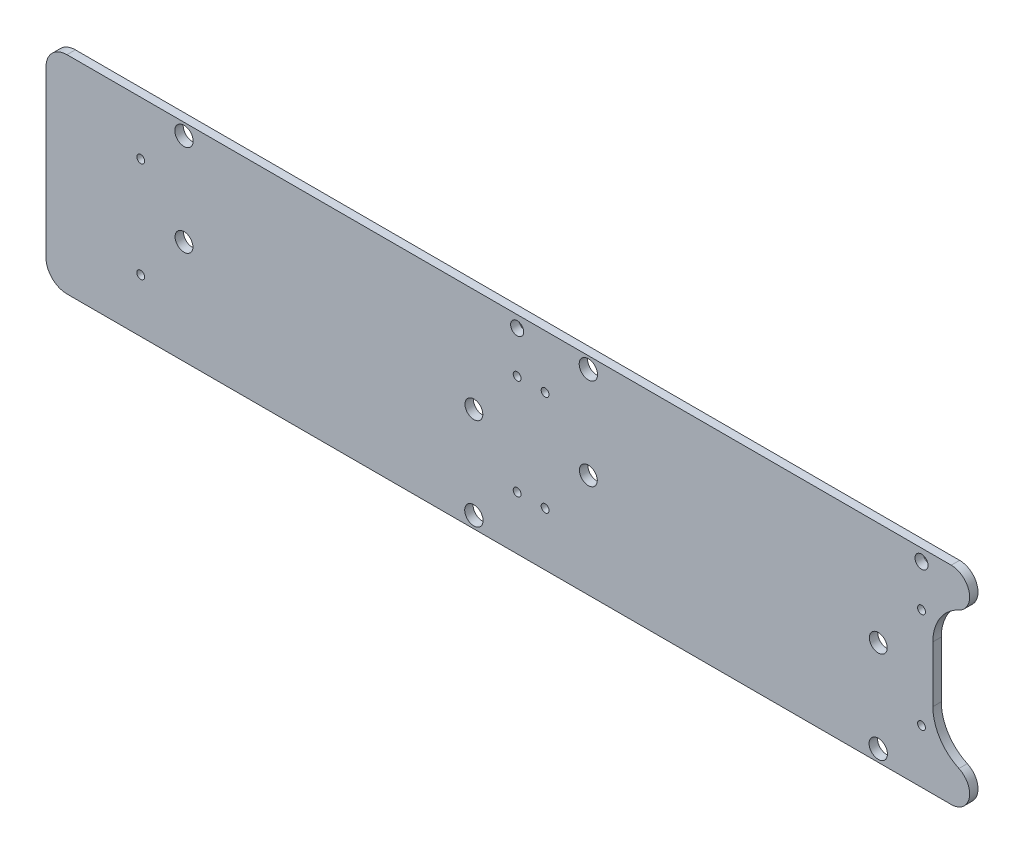
ISO-10303-21;
HEADER;
FILE_DESCRIPTION(('STEP AP214'),'2;1');
FILE_NAME('part.step','',(''),(''),'','','');
FILE_SCHEMA(('AUTOMOTIVE_DESIGN { 1 0 10303 214 1 1 1 1 }'));
ENDSEC;
DATA;
#1=APPLICATION_CONTEXT('core data for automotive mechanical design processes');
#2=APPLICATION_PROTOCOL_DEFINITION('international standard','automotive_design',2000,#1);
#3=PRODUCT_CONTEXT('',#1,'mechanical');
#4=PRODUCT('Part','Part','',(#3));
#5=PRODUCT_RELATED_PRODUCT_CATEGORY('part','',(#4));
#6=PRODUCT_DEFINITION_FORMATION('','',#4);
#7=PRODUCT_DEFINITION_CONTEXT('part definition',#1,'design');
#8=PRODUCT_DEFINITION('design','',#6,#7);
#9=PRODUCT_DEFINITION_SHAPE('','',#8);
#10=(LENGTH_UNIT() NAMED_UNIT(*) SI_UNIT(.MILLI.,.METRE.));
#11=(NAMED_UNIT(*) PLANE_ANGLE_UNIT() SI_UNIT($,.RADIAN.));
#12=(NAMED_UNIT(*) SI_UNIT($,.STERADIAN.) SOLID_ANGLE_UNIT());
#13=UNCERTAINTY_MEASURE_WITH_UNIT(LENGTH_MEASURE(1.E-05),#10,'distance_accuracy_value','');
#14=(GEOMETRIC_REPRESENTATION_CONTEXT(3) GLOBAL_UNCERTAINTY_ASSIGNED_CONTEXT((#13)) GLOBAL_UNIT_ASSIGNED_CONTEXT((#10,
#11,#12)) REPRESENTATION_CONTEXT('',''));
#15=CARTESIAN_POINT('',(0.,0.,0.));
#16=DIRECTION('',(0.,0.,1.));
#17=DIRECTION('',(1.,0.,0.));
#18=AXIS2_PLACEMENT_3D('',#15,#16,#17);
#19=CARTESIAN_POINT('',(0.,0.,0.));
#20=DIRECTION('',(0.,0.,-1.));
#21=DIRECTION('',(-1.,0.,0.));
#22=AXIS2_PLACEMENT_3D('',#19,#20,#21);
#23=PLANE('',#22);
#24=CARTESIAN_POINT('',(144.094561670845,20.25,0.));
#25=DIRECTION('',(0.,0.,-1.));
#26=DIRECTION('',(-1.,0.,0.));
#27=AXIS2_PLACEMENT_3D('',#24,#25,#26);
#28=CIRCLE('',#27,1.69999999999998);
#29=CARTESIAN_POINT('',(142.394561670845,20.25,0.));
#30=VERTEX_POINT('',#29);
#31=EDGE_CURVE('E333',#30,#30,#28,.T.);
#32=ORIENTED_EDGE('',*,*,#31,.F.);
#33=EDGE_LOOP('',(#32));
#34=FACE_BOUND('',#33,.T.);
#35=CARTESIAN_POINT('',(88.849561670845,20.25,0.));
#36=DIRECTION('',(0.,0.,-1.));
#37=DIRECTION('',(-1.,0.,0.));
#38=AXIS2_PLACEMENT_3D('',#35,#36,#37);
#39=CIRCLE('',#38,1.69999999999999);
#40=CARTESIAN_POINT('',(87.149561670845,20.25,0.));
#41=VERTEX_POINT('',#40);
#42=EDGE_CURVE('E335',#41,#41,#39,.T.);
#43=ORIENTED_EDGE('',*,*,#42,.F.);
#44=EDGE_LOOP('',(#43));
#45=FACE_BOUND('',#44,.T.);
#46=CARTESIAN_POINT('',(67.0386850125363,20.25,0.));
#47=DIRECTION('',(0.,0.,-1.));
#48=DIRECTION('',(-1.,0.,0.));
#49=AXIS2_PLACEMENT_3D('',#46,#47,#48);
#50=CIRCLE('',#49,1.69999999999999);
#51=CARTESIAN_POINT('',(65.3386850125364,20.25,0.));
#52=VERTEX_POINT('',#51);
#53=EDGE_CURVE('E343',#52,#52,#50,.T.);
#54=ORIENTED_EDGE('',*,*,#53,.F.);
#55=EDGE_LOOP('',(#54));
#56=FACE_BOUND('',#55,.T.);
#57=CARTESIAN_POINT('',(11.7936850125363,20.25,0.));
#58=DIRECTION('',(0.,0.,-1.));
#59=DIRECTION('',(-1.,0.,0.));
#60=AXIS2_PLACEMENT_3D('',#57,#58,#59);
#61=CIRCLE('',#60,1.69999999999999);
#62=CARTESIAN_POINT('',(10.0936850125363,20.25,0.));
#63=VERTEX_POINT('',#62);
#64=EDGE_CURVE('E349',#63,#63,#61,.T.);
#65=ORIENTED_EDGE('',*,*,#64,.F.);
#66=EDGE_LOOP('',(#65));
#67=FACE_BOUND('',#66,.T.);
#68=CARTESIAN_POINT('',(75.2809850125364,37.7506,0.));
#69=DIRECTION('',(0.,0.,-1.));
#70=DIRECTION('',(-1.,0.,0.));
#71=AXIS2_PLACEMENT_3D('',#68,#69,#70);
#72=CIRCLE('',#71,1.25);
#73=CARTESIAN_POINT('',(74.0309850125363,37.7506,0.));
#74=VERTEX_POINT('',#73);
#75=EDGE_CURVE('E358',#74,#74,#72,.T.);
#76=ORIENTED_EDGE('',*,*,#75,.F.);
#77=EDGE_LOOP('',(#76));
#78=FACE_BOUND('',#77,.T.);
#79=CARTESIAN_POINT('',(152.336861670845,37.7506,0.));
#80=DIRECTION('',(0.,0.,-1.));
#81=DIRECTION('',(-1.,0.,0.));
#82=AXIS2_PLACEMENT_3D('',#79,#80,#81);
#83=CIRCLE('',#82,1.25000000000001);
#84=CARTESIAN_POINT('',(151.086861670845,37.7506,0.));
#85=VERTEX_POINT('',#84);
#86=EDGE_CURVE('E364',#85,#85,#83,.T.);
#87=ORIENTED_EDGE('',*,*,#86,.F.);
#88=EDGE_LOOP('',(#87));
#89=FACE_BOUND('',#88,.T.);
#90=CARTESIAN_POINT('',(152.336861670825,29.8131,0.));
#91=DIRECTION('',(0.,0.,1.));
#92=DIRECTION('',(1.,0.,0.));
#93=AXIS2_PLACEMENT_3D('',#90,#91,#92);
#94=CIRCLE('',#93,0.750000000000012);
#95=CARTESIAN_POINT('',(153.086861670825,29.8131,0.));
#96=VERTEX_POINT('',#95);
#97=EDGE_CURVE('E368',#96,#96,#94,.T.);
#98=ORIENTED_EDGE('',*,*,#97,.T.);
#99=EDGE_LOOP('',(#98));
#100=FACE_BOUND('',#99,.T.);
#101=CARTESIAN_POINT('',(152.336861670825,10.6985,0.));
#102=DIRECTION('',(0.,0.,1.));
#103=DIRECTION('',(1.,0.,0.));
#104=AXIS2_PLACEMENT_3D('',#101,#102,#103);
#105=CIRCLE('',#104,0.750000000000012);
#106=CARTESIAN_POINT('',(153.086861670825,10.6985,0.));
#107=VERTEX_POINT('',#106);
#108=EDGE_CURVE('E374',#107,#107,#105,.T.);
#109=ORIENTED_EDGE('',*,*,#108,.T.);
#110=EDGE_LOOP('',(#109));
#111=FACE_BOUND('',#110,.T.);
#112=CARTESIAN_POINT('',(75.2809850125166,29.8131000000001,0.));
#113=DIRECTION('',(0.,0.,1.));
#114=DIRECTION('',(1.,0.,0.));
#115=AXIS2_PLACEMENT_3D('',#112,#113,#114);
#116=CIRCLE('',#115,0.749999999999999);
#117=CARTESIAN_POINT('',(76.0309850125166,29.8131000000001,0.));
#118=VERTEX_POINT('',#117);
#119=EDGE_CURVE('E380',#118,#118,#116,.T.);
#120=ORIENTED_EDGE('',*,*,#119,.T.);
#121=EDGE_LOOP('',(#120));
#122=FACE_BOUND('',#121,.T.);
#123=CARTESIAN_POINT('',(80.6072616708648,29.8131,0.));
#124=DIRECTION('',(0.,0.,1.));
#125=DIRECTION('',(1.,0.,0.));
#126=AXIS2_PLACEMENT_3D('',#123,#124,#125);
#127=CIRCLE('',#126,0.749999999999999);
#128=CARTESIAN_POINT('',(81.3572616708648,29.8131,0.));
#129=VERTEX_POINT('',#128);
#130=EDGE_CURVE('E386',#129,#129,#127,.T.);
#131=ORIENTED_EDGE('',*,*,#130,.T.);
#132=EDGE_LOOP('',(#131));
#133=FACE_BOUND('',#132,.T.);
#134=CARTESIAN_POINT('',(80.6072616708648,10.6985,0.));
#135=DIRECTION('',(0.,0.,1.));
#136=DIRECTION('',(1.,0.,0.));
#137=AXIS2_PLACEMENT_3D('',#134,#135,#136);
#138=CIRCLE('',#137,0.749999999999999);
#139=CARTESIAN_POINT('',(81.3572616708648,10.6985,0.));
#140=VERTEX_POINT('',#139);
#141=EDGE_CURVE('E392',#140,#140,#138,.T.);
#142=ORIENTED_EDGE('',*,*,#141,.T.);
#143=EDGE_LOOP('',(#142));
#144=FACE_BOUND('',#143,.T.);
#145=CARTESIAN_POINT('',(75.2809850125166,10.6985,0.));
#146=DIRECTION('',(0.,0.,1.));
#147=DIRECTION('',(1.,0.,0.));
#148=AXIS2_PLACEMENT_3D('',#145,#146,#147);
#149=CIRCLE('',#148,0.749999999999999);
#150=CARTESIAN_POINT('',(76.0309850125166,10.6985,0.));
#151=VERTEX_POINT('',#150);
#152=EDGE_CURVE('E398',#151,#151,#149,.T.);
#153=ORIENTED_EDGE('',*,*,#152,.T.);
#154=EDGE_LOOP('',(#153));
#155=FACE_BOUND('',#154,.T.);
#156=CARTESIAN_POINT('',(3.55138501255611,10.6985,0.));
#157=DIRECTION('',(0.,0.,1.));
#158=DIRECTION('',(1.,0.,0.));
#159=AXIS2_PLACEMENT_3D('',#156,#157,#158);
#160=CIRCLE('',#159,0.75);
#161=CARTESIAN_POINT('',(4.30138501255611,10.6985,0.));
#162=VERTEX_POINT('',#161);
#163=EDGE_CURVE('E404',#162,#162,#160,.T.);
#164=ORIENTED_EDGE('',*,*,#163,.T.);
#165=EDGE_LOOP('',(#164));
#166=FACE_BOUND('',#165,.T.);
#167=CARTESIAN_POINT('',(3.55138501255612,29.8131,0.));
#168=DIRECTION('',(0.,0.,1.));
#169=DIRECTION('',(1.,0.,0.));
#170=AXIS2_PLACEMENT_3D('',#167,#168,#169);
#171=CIRCLE('',#170,0.75);
#172=CARTESIAN_POINT('',(4.30138501255612,29.8131,0.));
#173=VERTEX_POINT('',#172);
#174=EDGE_CURVE('E410',#173,#173,#171,.T.);
#175=ORIENTED_EDGE('',*,*,#174,.T.);
#176=EDGE_LOOP('',(#175));
#177=FACE_BOUND('',#176,.T.);
#178=CARTESIAN_POINT('',(11.7936850125363,37.7506,0.));
#179=DIRECTION('',(0.,0.,1.));
#180=DIRECTION('',(1.,0.,0.));
#181=AXIS2_PLACEMENT_3D('',#178,#179,#180);
#182=CIRCLE('',#181,1.75);
#183=CARTESIAN_POINT('',(13.5436850125363,37.7506,0.));
#184=VERTEX_POINT('',#183);
#185=EDGE_CURVE('E416',#184,#184,#182,.T.);
#186=ORIENTED_EDGE('',*,*,#185,.T.);
#187=EDGE_LOOP('',(#186));
#188=FACE_BOUND('',#187,.T.);
#189=CARTESIAN_POINT('',(67.0386850125363,2.74940000000002,0.));
#190=DIRECTION('',(0.,0.,1.));
#191=DIRECTION('',(1.,0.,0.));
#192=AXIS2_PLACEMENT_3D('',#189,#190,#191);
#193=CIRCLE('',#192,1.75);
#194=CARTESIAN_POINT('',(68.7886850125363,2.74940000000002,0.));
#195=VERTEX_POINT('',#194);
#196=EDGE_CURVE('E422',#195,#195,#193,.T.);
#197=ORIENTED_EDGE('',*,*,#196,.T.);
#198=EDGE_LOOP('',(#197));
#199=FACE_BOUND('',#198,.T.);
#200=CARTESIAN_POINT('',(88.849561670845,37.7506,0.));
#201=DIRECTION('',(0.,0.,1.));
#202=DIRECTION('',(1.,0.,0.));
#203=AXIS2_PLACEMENT_3D('',#200,#201,#202);
#204=CIRCLE('',#203,1.75);
#205=CARTESIAN_POINT('',(90.599561670845,37.7506,0.));
#206=VERTEX_POINT('',#205);
#207=EDGE_CURVE('E428',#206,#206,#204,.T.);
#208=ORIENTED_EDGE('',*,*,#207,.T.);
#209=EDGE_LOOP('',(#208));
#210=FACE_BOUND('',#209,.T.);
#211=CARTESIAN_POINT('',(144.094561670845,2.7494,0.));
#212=DIRECTION('',(0.,0.,1.));
#213=DIRECTION('',(1.,0.,0.));
#214=AXIS2_PLACEMENT_3D('',#211,#212,#213);
#215=CIRCLE('',#214,1.75000000000001);
#216=CARTESIAN_POINT('',(145.844561670845,2.7494,0.));
#217=VERTEX_POINT('',#216);
#218=EDGE_CURVE('E205',#217,#217,#215,.T.);
#219=ORIENTED_EDGE('',*,*,#218,.T.);
#220=EDGE_LOOP('',(#219));
#221=FACE_BOUND('',#220,.T.);
#222=DIRECTION('',(1.,0.,0.));
#223=VECTOR('',#222,1.);
#224=CARTESIAN_POINT('',(0.5,0.5,0.));
#225=LINE('',#224,#223);
#226=CARTESIAN_POINT('',(-10.5,0.5,0.));
#227=VERTEX_POINT('',#226);
#228=CARTESIAN_POINT('',(158.,0.5,0.));
#229=VERTEX_POINT('',#228);
#230=EDGE_CURVE('E148',#227,#229,#225,.T.);
#231=ORIENTED_EDGE('',*,*,#230,.F.);
#232=CARTESIAN_POINT('',(-10.5,4.5,0.));
#233=DIRECTION('',(0.,0.,-1.));
#234=DIRECTION('',(-1.,0.,0.));
#235=AXIS2_PLACEMENT_3D('',#232,#233,#234);
#236=CIRCLE('',#235,4.);
#237=CARTESIAN_POINT('',(-14.5,4.5,0.));
#238=VERTEX_POINT('',#237);
#239=EDGE_CURVE('E182',#227,#238,#236,.T.);
#240=ORIENTED_EDGE('',*,*,#239,.T.);
#241=DIRECTION('',(0.,1.,0.));
#242=VECTOR('',#241,1.);
#243=CARTESIAN_POINT('',(-14.5,0.5,0.));
#244=LINE('',#243,#242);
#245=CARTESIAN_POINT('',(-14.5,36.,0.));
#246=VERTEX_POINT('',#245);
#247=EDGE_CURVE('E201',#238,#246,#244,.T.);
#248=ORIENTED_EDGE('',*,*,#247,.T.);
#249=CARTESIAN_POINT('',(-10.5,36.,0.));
#250=DIRECTION('',(0.,0.,-1.));
#251=DIRECTION('',(-1.,0.,0.));
#252=AXIS2_PLACEMENT_3D('',#249,#250,#251);
#253=CIRCLE('',#252,4.);
#254=CARTESIAN_POINT('',(-10.5,40.,0.));
#255=VERTEX_POINT('',#254);
#256=EDGE_CURVE('E180',#246,#255,#253,.T.);
#257=ORIENTED_EDGE('',*,*,#256,.T.);
#258=DIRECTION('',(-1.,0.,0.));
#259=VECTOR('',#258,1.);
#260=CARTESIAN_POINT('',(158.,40.,0.));
#261=LINE('',#260,#259);
#262=CARTESIAN_POINT('',(158.,40.,0.));
#263=VERTEX_POINT('',#262);
#264=EDGE_CURVE('E143',#263,#255,#261,.T.);
#265=ORIENTED_EDGE('',*,*,#264,.F.);
#266=CARTESIAN_POINT('',(158.,36.5,0.));
#267=DIRECTION('',(0.,0.,1.));
#268=DIRECTION('',(1.,0.,0.));
#269=AXIS2_PLACEMENT_3D('',#266,#267,#268);
#270=CIRCLE('',#269,3.50000000000003);
#271=CARTESIAN_POINT('',(159.458333333333,33.3182922998978,0.));
#272=VERTEX_POINT('',#271);
#273=EDGE_CURVE('E141',#272,#263,#270,.T.);
#274=ORIENTED_EDGE('',*,*,#273,.F.);
#275=CARTESIAN_POINT('',(163.,25.5912878853642,0.));
#276=DIRECTION('',(0.,0.,-1.));
#277=DIRECTION('',(1.,0.,0.));
#278=AXIS2_PLACEMENT_3D('',#275,#276,#277);
#279=CIRCLE('',#278,8.50000000000001);
#280=CARTESIAN_POINT('',(154.5,25.5912878853642,0.));
#281=VERTEX_POINT('',#280);
#282=EDGE_CURVE('E120',#281,#272,#279,.T.);
#283=ORIENTED_EDGE('',*,*,#282,.F.);
#284=DIRECTION('',(0.,1.,0.));
#285=VECTOR('',#284,1.);
#286=CARTESIAN_POINT('',(154.5,14.9087121146357,0.));
#287=LINE('',#286,#285);
#288=CARTESIAN_POINT('',(154.5,14.9087121146357,0.));
#289=VERTEX_POINT('',#288);
#290=EDGE_CURVE('E130',#289,#281,#287,.T.);
#291=ORIENTED_EDGE('',*,*,#290,.F.);
#292=CARTESIAN_POINT('',(163.,14.9087121146357,0.));
#293=DIRECTION('',(0.,0.,-1.));
#294=DIRECTION('',(1.,0.,0.));
#295=AXIS2_PLACEMENT_3D('',#292,#293,#294);
#296=CIRCLE('',#295,8.5);
#297=CARTESIAN_POINT('',(159.458333333333,7.18170770010208,0.));
#298=VERTEX_POINT('',#297);
#299=EDGE_CURVE('E136',#298,#289,#296,.T.);
#300=ORIENTED_EDGE('',*,*,#299,.F.);
#301=CARTESIAN_POINT('',(158.,4.,0.));
#302=DIRECTION('',(0.,0.,1.));
#303=DIRECTION('',(1.,0.,0.));
#304=AXIS2_PLACEMENT_3D('',#301,#302,#303);
#305=CIRCLE('',#304,3.5);
#306=EDGE_CURVE('E168',#229,#298,#305,.T.);
#307=ORIENTED_EDGE('',*,*,#306,.F.);
#308=EDGE_LOOP('',(#231,#240,#248,#257,#265,#274,#283,#291,#300,#307));
#309=FACE_BOUND('',#308,.T.);
#310=ADVANCED_FACE('F37',(#34,#45,#56,#67,#78,#89,#100,#111,#122,#133,#144,#155,#166,#177,#188,
#199,#210,#221,#309),#23,.T.);
#311=CARTESIAN_POINT('',(158.,4.,0.));
#312=DIRECTION('',(0.,0.,1.));
#313=DIRECTION('',(1.,0.,0.));
#314=AXIS2_PLACEMENT_3D('',#311,#312,#313);
#315=CYLINDRICAL_SURFACE('',#314,3.5);
#316=CARTESIAN_POINT('',(158.,4.,1.6));
#317=DIRECTION('',(0.,0.,1.));
#318=DIRECTION('',(1.,0.,0.));
#319=AXIS2_PLACEMENT_3D('',#316,#317,#318);
#320=CIRCLE('',#319,3.5);
#321=CARTESIAN_POINT('',(158.,0.5,1.6));
#322=VERTEX_POINT('',#321);
#323=CARTESIAN_POINT('',(159.458333333333,7.18170770010208,1.6));
#324=VERTEX_POINT('',#323);
#325=EDGE_CURVE('E151',#322,#324,#320,.T.);
#326=ORIENTED_EDGE('',*,*,#325,.F.);
#327=DIRECTION('',(0.,0.,1.));
#328=VECTOR('',#327,1.);
#329=CARTESIAN_POINT('',(158.,0.5,0.));
#330=LINE('',#329,#328);
#331=EDGE_CURVE('E169',#229,#322,#330,.T.);
#332=ORIENTED_EDGE('',*,*,#331,.F.);
#333=ORIENTED_EDGE('',*,*,#306,.T.);
#334=DIRECTION('',(0.,0.,1.));
#335=VECTOR('',#334,1.);
#336=CARTESIAN_POINT('',(159.458333333333,7.18170770010208,0.));
#337=LINE('',#336,#335);
#338=EDGE_CURVE('E150',#298,#324,#337,.T.);
#339=ORIENTED_EDGE('',*,*,#338,.T.);
#340=EDGE_LOOP('',(#326,#332,#333,#339));
#341=FACE_BOUND('',#340,.T.);
#342=ADVANCED_FACE('F218',(#341),#315,.T.);
#343=CARTESIAN_POINT('',(0.5,0.5,0.));
#344=DIRECTION('',(0.,-1.,0.));
#345=DIRECTION('',(0.,0.,-1.));
#346=AXIS2_PLACEMENT_3D('',#343,#344,#345);
#347=PLANE('',#346);
#348=DIRECTION('',(1.,0.,0.));
#349=VECTOR('',#348,1.);
#350=CARTESIAN_POINT('',(0.5,0.5,1.6));
#351=LINE('',#350,#349);
#352=CARTESIAN_POINT('',(-10.5,0.5,1.6));
#353=VERTEX_POINT('',#352);
#354=EDGE_CURVE('E166',#353,#322,#351,.T.);
#355=ORIENTED_EDGE('',*,*,#354,.F.);
#356=DIRECTION('',(0.,0.,-1.));
#357=VECTOR('',#356,1.);
#358=CARTESIAN_POINT('',(-10.5,0.5,0.));
#359=LINE('',#358,#357);
#360=EDGE_CURVE('E172',#353,#227,#359,.T.);
#361=ORIENTED_EDGE('',*,*,#360,.T.);
#362=ORIENTED_EDGE('',*,*,#230,.T.);
#363=ORIENTED_EDGE('',*,*,#331,.T.);
#364=EDGE_LOOP('',(#355,#361,#362,#363));
#365=FACE_BOUND('',#364,.T.);
#366=ADVANCED_FACE('F196',(#365),#347,.T.);
#367=CARTESIAN_POINT('',(158.,40.,0.));
#368=DIRECTION('',(0.,1.,0.));
#369=DIRECTION('',(-1.,0.,0.));
#370=AXIS2_PLACEMENT_3D('',#367,#368,#369);
#371=PLANE('',#370);
#372=ORIENTED_EDGE('',*,*,#264,.T.);
#373=DIRECTION('',(0.,0.,-1.));
#374=VECTOR('',#373,1.);
#375=CARTESIAN_POINT('',(-10.5,40.,0.));
#376=LINE('',#375,#374);
#377=CARTESIAN_POINT('',(-10.5,40.,1.6));
#378=VERTEX_POINT('',#377);
#379=EDGE_CURVE('E11',#255,#378,#376,.F.);
#380=ORIENTED_EDGE('',*,*,#379,.T.);
#381=DIRECTION('',(-1.,0.,0.));
#382=VECTOR('',#381,1.);
#383=CARTESIAN_POINT('',(158.,40.,1.6));
#384=LINE('',#383,#382);
#385=CARTESIAN_POINT('',(158.,40.,1.6));
#386=VERTEX_POINT('',#385);
#387=EDGE_CURVE('E164',#386,#378,#384,.T.);
#388=ORIENTED_EDGE('',*,*,#387,.F.);
#389=DIRECTION('',(0.,0.,1.));
#390=VECTOR('',#389,1.);
#391=CARTESIAN_POINT('',(158.,40.,0.));
#392=LINE('',#391,#390);
#393=EDGE_CURVE('E173',#263,#386,#392,.T.);
#394=ORIENTED_EDGE('',*,*,#393,.F.);
#395=EDGE_LOOP('',(#372,#380,#388,#394));
#396=FACE_BOUND('',#395,.T.);
#397=ADVANCED_FACE('F223',(#396),#371,.T.);
#398=CARTESIAN_POINT('',(158.,36.5,0.));
#399=DIRECTION('',(0.,0.,1.));
#400=DIRECTION('',(1.,0.,0.));
#401=AXIS2_PLACEMENT_3D('',#398,#399,#400);
#402=CYLINDRICAL_SURFACE('',#401,3.50000000000003);
#403=CARTESIAN_POINT('',(158.,36.5,1.6));
#404=DIRECTION('',(0.,0.,1.));
#405=DIRECTION('',(1.,0.,0.));
#406=AXIS2_PLACEMENT_3D('',#403,#404,#405);
#407=CIRCLE('',#406,3.50000000000003);
#408=CARTESIAN_POINT('',(159.458333333333,33.3182922998978,1.6));
#409=VERTEX_POINT('',#408);
#410=EDGE_CURVE('E161',#409,#386,#407,.T.);
#411=ORIENTED_EDGE('',*,*,#410,.F.);
#412=DIRECTION('',(0.,0.,1.));
#413=VECTOR('',#412,1.);
#414=CARTESIAN_POINT('',(159.458333333333,33.3182922998978,0.));
#415=LINE('',#414,#413);
#416=EDGE_CURVE('E126',#272,#409,#415,.T.);
#417=ORIENTED_EDGE('',*,*,#416,.F.);
#418=ORIENTED_EDGE('',*,*,#273,.T.);
#419=ORIENTED_EDGE('',*,*,#393,.T.);
#420=EDGE_LOOP('',(#411,#417,#418,#419));
#421=FACE_BOUND('',#420,.T.);
#422=ADVANCED_FACE('F222',(#421),#402,.T.);
#423=CARTESIAN_POINT('',(163.,25.5912878853642,0.));
#424=DIRECTION('',(0.,0.,1.));
#425=DIRECTION('',(1.,0.,0.));
#426=AXIS2_PLACEMENT_3D('',#423,#424,#425);
#427=CYLINDRICAL_SURFACE('',#426,8.50000000000001);
#428=CARTESIAN_POINT('',(163.,25.5912878853642,1.6));
#429=DIRECTION('',(0.,0.,-1.));
#430=DIRECTION('',(1.,0.,0.));
#431=AXIS2_PLACEMENT_3D('',#428,#429,#430);
#432=CIRCLE('',#431,8.50000000000001);
#433=CARTESIAN_POINT('',(154.5,25.5912878853642,1.6));
#434=VERTEX_POINT('',#433);
#435=EDGE_CURVE('E123',#434,#409,#432,.T.);
#436=ORIENTED_EDGE('',*,*,#435,.F.);
#437=DIRECTION('',(0.,0.,1.));
#438=VECTOR('',#437,1.);
#439=CARTESIAN_POINT('',(154.5,25.5912878853642,0.));
#440=LINE('',#439,#438);
#441=EDGE_CURVE('E116',#281,#434,#440,.T.);
#442=ORIENTED_EDGE('',*,*,#441,.F.);
#443=ORIENTED_EDGE('',*,*,#282,.T.);
#444=ORIENTED_EDGE('',*,*,#416,.T.);
#445=EDGE_LOOP('',(#436,#442,#443,#444));
#446=FACE_BOUND('',#445,.T.);
#447=ADVANCED_FACE('F118',(#446),#427,.F.);
#448=CARTESIAN_POINT('',(154.5,14.9087121146357,0.));
#449=DIRECTION('',(1.,0.,0.));
#450=DIRECTION('',(0.,0.,-1.));
#451=AXIS2_PLACEMENT_3D('',#448,#449,#450);
#452=PLANE('',#451);
#453=DIRECTION('',(0.,1.,0.));
#454=VECTOR('',#453,1.);
#455=CARTESIAN_POINT('',(154.5,14.9087121146357,1.6));
#456=LINE('',#455,#454);
#457=CARTESIAN_POINT('',(154.5,14.9087121146357,1.6));
#458=VERTEX_POINT('',#457);
#459=EDGE_CURVE('E158',#458,#434,#456,.T.);
#460=ORIENTED_EDGE('',*,*,#459,.F.);
#461=DIRECTION('',(0.,0.,1.));
#462=VECTOR('',#461,1.);
#463=CARTESIAN_POINT('',(154.5,14.9087121146357,0.));
#464=LINE('',#463,#462);
#465=EDGE_CURVE('E127',#289,#458,#464,.T.);
#466=ORIENTED_EDGE('',*,*,#465,.F.);
#467=ORIENTED_EDGE('',*,*,#290,.T.);
#468=ORIENTED_EDGE('',*,*,#441,.T.);
#469=EDGE_LOOP('',(#460,#466,#467,#468));
#470=FACE_BOUND('',#469,.T.);
#471=ADVANCED_FACE('F131',(#470),#452,.T.);
#472=CARTESIAN_POINT('',(163.,14.9087121146357,0.));
#473=DIRECTION('',(0.,0.,1.));
#474=DIRECTION('',(1.,0.,0.));
#475=AXIS2_PLACEMENT_3D('',#472,#473,#474);
#476=CYLINDRICAL_SURFACE('',#475,8.5);
#477=CARTESIAN_POINT('',(163.,14.9087121146357,1.6));
#478=DIRECTION('',(0.,0.,-1.));
#479=DIRECTION('',(1.,0.,0.));
#480=AXIS2_PLACEMENT_3D('',#477,#478,#479);
#481=CIRCLE('',#480,8.5);
#482=EDGE_CURVE('E154',#324,#458,#481,.T.);
#483=ORIENTED_EDGE('',*,*,#482,.F.);
#484=ORIENTED_EDGE('',*,*,#338,.F.);
#485=ORIENTED_EDGE('',*,*,#299,.T.);
#486=ORIENTED_EDGE('',*,*,#465,.T.);
#487=EDGE_LOOP('',(#483,#484,#485,#486));
#488=FACE_BOUND('',#487,.T.);
#489=ADVANCED_FACE('F216',(#488),#476,.F.);
#490=CARTESIAN_POINT('',(0.,0.,1.6));
#491=DIRECTION('',(0.,0.,-1.));
#492=DIRECTION('',(-1.,0.,0.));
#493=AXIS2_PLACEMENT_3D('',#490,#491,#492);
#494=PLANE('',#493);
#495=CARTESIAN_POINT('',(144.094561670845,20.25,1.6));
#496=DIRECTION('',(0.,0.,-1.));
#497=DIRECTION('',(-1.,0.,0.));
#498=AXIS2_PLACEMENT_3D('',#495,#496,#497);
#499=CIRCLE('',#498,1.70000000000001);
#500=CARTESIAN_POINT('',(142.394561670845,20.25,1.6));
#501=VERTEX_POINT('',#500);
#502=EDGE_CURVE('E331',#501,#501,#499,.T.);
#503=ORIENTED_EDGE('',*,*,#502,.T.);
#504=EDGE_LOOP('',(#503));
#505=FACE_BOUND('',#504,.T.);
#506=CARTESIAN_POINT('',(88.849561670845,20.25,1.6));
#507=DIRECTION('',(0.,0.,-1.));
#508=DIRECTION('',(-1.,0.,0.));
#509=AXIS2_PLACEMENT_3D('',#506,#507,#508);
#510=CIRCLE('',#509,1.69999999999999);
#511=CARTESIAN_POINT('',(87.149561670845,20.25,1.6));
#512=VERTEX_POINT('',#511);
#513=EDGE_CURVE('E340',#512,#512,#510,.T.);
#514=ORIENTED_EDGE('',*,*,#513,.T.);
#515=EDGE_LOOP('',(#514));
#516=FACE_BOUND('',#515,.T.);
#517=CARTESIAN_POINT('',(67.0386850125363,20.25,1.6));
#518=DIRECTION('',(0.,0.,-1.));
#519=DIRECTION('',(-1.,0.,0.));
#520=AXIS2_PLACEMENT_3D('',#517,#518,#519);
#521=CIRCLE('',#520,1.69999999999999);
#522=CARTESIAN_POINT('',(65.3386850125364,20.25,1.6));
#523=VERTEX_POINT('',#522);
#524=EDGE_CURVE('E346',#523,#523,#521,.T.);
#525=ORIENTED_EDGE('',*,*,#524,.T.);
#526=EDGE_LOOP('',(#525));
#527=FACE_BOUND('',#526,.T.);
#528=CARTESIAN_POINT('',(11.7936850125363,20.25,1.6));
#529=DIRECTION('',(0.,0.,-1.));
#530=DIRECTION('',(-1.,0.,0.));
#531=AXIS2_PLACEMENT_3D('',#528,#529,#530);
#532=CIRCLE('',#531,1.7);
#533=CARTESIAN_POINT('',(10.0936850125363,20.25,1.6));
#534=VERTEX_POINT('',#533);
#535=EDGE_CURVE('E352',#534,#534,#532,.T.);
#536=ORIENTED_EDGE('',*,*,#535,.T.);
#537=EDGE_LOOP('',(#536));
#538=FACE_BOUND('',#537,.T.);
#539=CARTESIAN_POINT('',(75.2809850125364,37.7506,1.6));
#540=DIRECTION('',(0.,0.,1.));
#541=DIRECTION('',(1.,0.,0.));
#542=AXIS2_PLACEMENT_3D('',#539,#540,#541);
#543=CIRCLE('',#542,1.25);
#544=CARTESIAN_POINT('',(76.5309850125364,37.7506,1.6));
#545=VERTEX_POINT('',#544);
#546=EDGE_CURVE('E355',#545,#545,#543,.T.);
#547=ORIENTED_EDGE('',*,*,#546,.F.);
#548=EDGE_LOOP('',(#547));
#549=FACE_BOUND('',#548,.T.);
#550=CARTESIAN_POINT('',(152.336861670845,37.7506,1.6));
#551=DIRECTION('',(0.,0.,1.));
#552=DIRECTION('',(1.,0.,0.));
#553=AXIS2_PLACEMENT_3D('',#550,#551,#552);
#554=CIRCLE('',#553,1.25000000000001);
#555=CARTESIAN_POINT('',(153.586861670845,37.7506,1.6));
#556=VERTEX_POINT('',#555);
#557=EDGE_CURVE('E361',#556,#556,#554,.T.);
#558=ORIENTED_EDGE('',*,*,#557,.F.);
#559=EDGE_LOOP('',(#558));
#560=FACE_BOUND('',#559,.T.);
#561=CARTESIAN_POINT('',(152.336861670825,29.8131,1.6));
#562=DIRECTION('',(0.,0.,1.));
#563=DIRECTION('',(1.,0.,0.));
#564=AXIS2_PLACEMENT_3D('',#561,#562,#563);
#565=CIRCLE('',#564,0.750000000000012);
#566=CARTESIAN_POINT('',(153.086861670825,29.8131,1.6));
#567=VERTEX_POINT('',#566);
#568=EDGE_CURVE('E367',#567,#567,#565,.T.);
#569=ORIENTED_EDGE('',*,*,#568,.F.);
#570=EDGE_LOOP('',(#569));
#571=FACE_BOUND('',#570,.T.);
#572=CARTESIAN_POINT('',(152.336861670825,10.6985,1.6));
#573=DIRECTION('',(0.,0.,1.));
#574=DIRECTION('',(1.,0.,0.));
#575=AXIS2_PLACEMENT_3D('',#572,#573,#574);
#576=CIRCLE('',#575,0.750000000000012);
#577=CARTESIAN_POINT('',(153.086861670825,10.6985,1.6));
#578=VERTEX_POINT('',#577);
#579=EDGE_CURVE('E371',#578,#578,#576,.T.);
#580=ORIENTED_EDGE('',*,*,#579,.F.);
#581=EDGE_LOOP('',(#580));
#582=FACE_BOUND('',#581,.T.);
#583=CARTESIAN_POINT('',(75.2809850125166,29.8131000000001,1.6));
#584=DIRECTION('',(0.,0.,1.));
#585=DIRECTION('',(1.,0.,0.));
#586=AXIS2_PLACEMENT_3D('',#583,#584,#585);
#587=CIRCLE('',#586,0.749999999999999);
#588=CARTESIAN_POINT('',(76.0309850125166,29.8131000000001,1.6));
#589=VERTEX_POINT('',#588);
#590=EDGE_CURVE('E377',#589,#589,#587,.T.);
#591=ORIENTED_EDGE('',*,*,#590,.F.);
#592=EDGE_LOOP('',(#591));
#593=FACE_BOUND('',#592,.T.);
#594=CARTESIAN_POINT('',(80.6072616708648,29.8131,1.6));
#595=DIRECTION('',(0.,0.,1.));
#596=DIRECTION('',(1.,0.,0.));
#597=AXIS2_PLACEMENT_3D('',#594,#595,#596);
#598=CIRCLE('',#597,0.749999999999999);
#599=CARTESIAN_POINT('',(81.3572616708648,29.8131,1.6));
#600=VERTEX_POINT('',#599);
#601=EDGE_CURVE('E383',#600,#600,#598,.T.);
#602=ORIENTED_EDGE('',*,*,#601,.F.);
#603=EDGE_LOOP('',(#602));
#604=FACE_BOUND('',#603,.T.);
#605=CARTESIAN_POINT('',(80.6072616708648,10.6985,1.6));
#606=DIRECTION('',(0.,0.,1.));
#607=DIRECTION('',(1.,0.,0.));
#608=AXIS2_PLACEMENT_3D('',#605,#606,#607);
#609=CIRCLE('',#608,0.749999999999999);
#610=CARTESIAN_POINT('',(81.3572616708648,10.6985,1.6));
#611=VERTEX_POINT('',#610);
#612=EDGE_CURVE('E389',#611,#611,#609,.T.);
#613=ORIENTED_EDGE('',*,*,#612,.F.);
#614=EDGE_LOOP('',(#613));
#615=FACE_BOUND('',#614,.T.);
#616=CARTESIAN_POINT('',(75.2809850125166,10.6985,1.6));
#617=DIRECTION('',(0.,0.,1.));
#618=DIRECTION('',(1.,0.,0.));
#619=AXIS2_PLACEMENT_3D('',#616,#617,#618);
#620=CIRCLE('',#619,0.749999999999999);
#621=CARTESIAN_POINT('',(76.0309850125166,10.6985,1.6));
#622=VERTEX_POINT('',#621);
#623=EDGE_CURVE('E395',#622,#622,#620,.T.);
#624=ORIENTED_EDGE('',*,*,#623,.F.);
#625=EDGE_LOOP('',(#624));
#626=FACE_BOUND('',#625,.T.);
#627=CARTESIAN_POINT('',(3.55138501255611,10.6985,1.6));
#628=DIRECTION('',(0.,0.,1.));
#629=DIRECTION('',(1.,0.,0.));
#630=AXIS2_PLACEMENT_3D('',#627,#628,#629);
#631=CIRCLE('',#630,0.75);
#632=CARTESIAN_POINT('',(4.30138501255611,10.6985,1.6));
#633=VERTEX_POINT('',#632);
#634=EDGE_CURVE('E401',#633,#633,#631,.T.);
#635=ORIENTED_EDGE('',*,*,#634,.F.);
#636=EDGE_LOOP('',(#635));
#637=FACE_BOUND('',#636,.T.);
#638=CARTESIAN_POINT('',(3.55138501255612,29.8131,1.6));
#639=DIRECTION('',(0.,0.,1.));
#640=DIRECTION('',(1.,0.,0.));
#641=AXIS2_PLACEMENT_3D('',#638,#639,#640);
#642=CIRCLE('',#641,0.75);
#643=CARTESIAN_POINT('',(4.30138501255612,29.8131,1.6));
#644=VERTEX_POINT('',#643);
#645=EDGE_CURVE('E407',#644,#644,#642,.T.);
#646=ORIENTED_EDGE('',*,*,#645,.F.);
#647=EDGE_LOOP('',(#646));
#648=FACE_BOUND('',#647,.T.);
#649=CARTESIAN_POINT('',(11.7936850125363,37.7506,1.6));
#650=DIRECTION('',(0.,0.,1.));
#651=DIRECTION('',(1.,0.,0.));
#652=AXIS2_PLACEMENT_3D('',#649,#650,#651);
#653=CIRCLE('',#652,1.75);
#654=CARTESIAN_POINT('',(13.5436850125363,37.7506,1.6));
#655=VERTEX_POINT('',#654);
#656=EDGE_CURVE('E413',#655,#655,#653,.T.);
#657=ORIENTED_EDGE('',*,*,#656,.F.);
#658=EDGE_LOOP('',(#657));
#659=FACE_BOUND('',#658,.T.);
#660=CARTESIAN_POINT('',(67.0386850125363,2.74940000000002,1.6));
#661=DIRECTION('',(0.,0.,1.));
#662=DIRECTION('',(1.,0.,0.));
#663=AXIS2_PLACEMENT_3D('',#660,#661,#662);
#664=CIRCLE('',#663,1.75);
#665=CARTESIAN_POINT('',(68.7886850125363,2.74940000000002,1.6));
#666=VERTEX_POINT('',#665);
#667=EDGE_CURVE('E419',#666,#666,#664,.T.);
#668=ORIENTED_EDGE('',*,*,#667,.F.);
#669=EDGE_LOOP('',(#668));
#670=FACE_BOUND('',#669,.T.);
#671=CARTESIAN_POINT('',(88.849561670845,37.7506,1.6));
#672=DIRECTION('',(0.,0.,1.));
#673=DIRECTION('',(1.,0.,0.));
#674=AXIS2_PLACEMENT_3D('',#671,#672,#673);
#675=CIRCLE('',#674,1.75);
#676=CARTESIAN_POINT('',(90.599561670845,37.7506,1.6));
#677=VERTEX_POINT('',#676);
#678=EDGE_CURVE('E425',#677,#677,#675,.T.);
#679=ORIENTED_EDGE('',*,*,#678,.F.);
#680=EDGE_LOOP('',(#679));
#681=FACE_BOUND('',#680,.T.);
#682=CARTESIAN_POINT('',(144.094561670845,2.7494,1.6));
#683=DIRECTION('',(0.,0.,1.));
#684=DIRECTION('',(1.,0.,0.));
#685=AXIS2_PLACEMENT_3D('',#682,#683,#684);
#686=CIRCLE('',#685,1.75000000000001);
#687=CARTESIAN_POINT('',(145.844561670845,2.7494,1.6));
#688=VERTEX_POINT('',#687);
#689=EDGE_CURVE('E209',#688,#688,#686,.T.);
#690=ORIENTED_EDGE('',*,*,#689,.F.);
#691=EDGE_LOOP('',(#690));
#692=FACE_BOUND('',#691,.T.);
#693=DIRECTION('',(0.,-1.,0.));
#694=VECTOR('',#693,1.);
#695=CARTESIAN_POINT('',(-14.5,0.5,1.6));
#696=LINE('',#695,#694);
#697=CARTESIAN_POINT('',(-14.5,36.,1.6));
#698=VERTEX_POINT('',#697);
#699=CARTESIAN_POINT('',(-14.5,4.5,1.6));
#700=VERTEX_POINT('',#699);
#701=EDGE_CURVE('E155',#698,#700,#696,.T.);
#702=ORIENTED_EDGE('',*,*,#701,.T.);
#703=CARTESIAN_POINT('',(-10.5,4.5,1.6));
#704=DIRECTION('',(0.,0.,-1.));
#705=DIRECTION('',(-1.,0.,0.));
#706=AXIS2_PLACEMENT_3D('',#703,#704,#705);
#707=CIRCLE('',#706,4.);
#708=EDGE_CURVE('E45',#700,#353,#707,.F.);
#709=ORIENTED_EDGE('',*,*,#708,.T.);
#710=ORIENTED_EDGE('',*,*,#354,.T.);
#711=ORIENTED_EDGE('',*,*,#325,.T.);
#712=ORIENTED_EDGE('',*,*,#482,.T.);
#713=ORIENTED_EDGE('',*,*,#459,.T.);
#714=ORIENTED_EDGE('',*,*,#435,.T.);
#715=ORIENTED_EDGE('',*,*,#410,.T.);
#716=ORIENTED_EDGE('',*,*,#387,.T.);
#717=CARTESIAN_POINT('',(-10.5,36.,1.6));
#718=DIRECTION('',(0.,0.,-1.));
#719=DIRECTION('',(-1.,0.,0.));
#720=AXIS2_PLACEMENT_3D('',#717,#718,#719);
#721=CIRCLE('',#720,4.);
#722=EDGE_CURVE('E188',#378,#698,#721,.F.);
#723=ORIENTED_EDGE('',*,*,#722,.T.);
#724=EDGE_LOOP('',(#702,#709,#710,#711,#712,#713,#714,#715,#716,#723));
#725=FACE_BOUND('',#724,.T.);
#726=ADVANCED_FACE('F192',(#505,#516,#527,#538,#549,#560,#571,#582,#593,#604,#615,#626,#637,
#648,#659,#670,#681,#692,#725),#494,.F.);
#727=CARTESIAN_POINT('',(-14.5,0.5,43.852218876646));
#728=DIRECTION('',(-1.,0.,0.));
#729=DIRECTION('',(0.,0.,1.));
#730=AXIS2_PLACEMENT_3D('',#727,#728,#729);
#731=PLANE('',#730);
#732=ORIENTED_EDGE('',*,*,#247,.F.);
#733=DIRECTION('',(0.,0.,-1.));
#734=VECTOR('',#733,1.);
#735=CARTESIAN_POINT('',(-14.5,4.5,43.852218876646));
#736=LINE('',#735,#734);
#737=EDGE_CURVE('E58',#238,#700,#736,.F.);
#738=ORIENTED_EDGE('',*,*,#737,.T.);
#739=ORIENTED_EDGE('',*,*,#701,.F.);
#740=DIRECTION('',(0.,0.,-1.));
#741=VECTOR('',#740,1.);
#742=CARTESIAN_POINT('',(-14.5,36.,43.852218876646));
#743=LINE('',#742,#741);
#744=EDGE_CURVE('E184',#698,#246,#743,.T.);
#745=ORIENTED_EDGE('',*,*,#744,.T.);
#746=EDGE_LOOP('',(#732,#738,#739,#745));
#747=FACE_BOUND('',#746,.T.);
#748=ADVANCED_FACE('F203',(#747),#731,.T.);
#749=CARTESIAN_POINT('',(-10.5,4.5,0.));
#750=DIRECTION('',(0.,0.,-1.));
#751=DIRECTION('',(-1.,0.,0.));
#752=AXIS2_PLACEMENT_3D('',#749,#750,#751);
#753=CYLINDRICAL_SURFACE('',#752,4.);
#754=ORIENTED_EDGE('',*,*,#708,.F.);
#755=ORIENTED_EDGE('',*,*,#737,.F.);
#756=ORIENTED_EDGE('',*,*,#239,.F.);
#757=ORIENTED_EDGE('',*,*,#360,.F.);
#758=EDGE_LOOP('',(#754,#755,#756,#757));
#759=FACE_BOUND('',#758,.T.);
#760=ADVANCED_FACE('F199',(#759),#753,.T.);
#761=CARTESIAN_POINT('',(-10.5,36.,43.852218876646));
#762=DIRECTION('',(0.,0.,-1.));
#763=DIRECTION('',(-1.,0.,0.));
#764=AXIS2_PLACEMENT_3D('',#761,#762,#763);
#765=CYLINDRICAL_SURFACE('',#764,4.);
#766=ORIENTED_EDGE('',*,*,#722,.F.);
#767=ORIENTED_EDGE('',*,*,#379,.F.);
#768=ORIENTED_EDGE('',*,*,#256,.F.);
#769=ORIENTED_EDGE('',*,*,#744,.F.);
#770=EDGE_LOOP('',(#766,#767,#768,#769));
#771=FACE_BOUND('',#770,.T.);
#772=ADVANCED_FACE('F39',(#771),#765,.T.);
#773=CARTESIAN_POINT('',(144.094561670845,2.7494,0.));
#774=DIRECTION('',(0.,0.,1.));
#775=DIRECTION('',(1.,0.,0.));
#776=AXIS2_PLACEMENT_3D('',#773,#774,#775);
#777=CYLINDRICAL_SURFACE('',#776,1.75000000000001);
#778=ORIENTED_EDGE('',*,*,#218,.F.);
#779=EDGE_LOOP('',(#778));
#780=FACE_BOUND('',#779,.T.);
#781=ORIENTED_EDGE('',*,*,#689,.T.);
#782=EDGE_LOOP('',(#781));
#783=FACE_BOUND('',#782,.T.);
#784=ADVANCED_FACE('F249',(#780,#783),#777,.F.);
#785=CARTESIAN_POINT('',(88.849561670845,37.7506,0.));
#786=DIRECTION('',(0.,0.,1.));
#787=DIRECTION('',(1.,0.,0.));
#788=AXIS2_PLACEMENT_3D('',#785,#786,#787);
#789=CYLINDRICAL_SURFACE('',#788,1.75);
#790=ORIENTED_EDGE('',*,*,#207,.F.);
#791=EDGE_LOOP('',(#790));
#792=FACE_BOUND('',#791,.T.);
#793=ORIENTED_EDGE('',*,*,#678,.T.);
#794=EDGE_LOOP('',(#793));
#795=FACE_BOUND('',#794,.T.);
#796=ADVANCED_FACE('F258',(#792,#795),#789,.F.);
#797=CARTESIAN_POINT('',(67.0386850125363,2.74940000000002,0.));
#798=DIRECTION('',(0.,0.,1.));
#799=DIRECTION('',(1.,0.,0.));
#800=AXIS2_PLACEMENT_3D('',#797,#798,#799);
#801=CYLINDRICAL_SURFACE('',#800,1.75);
#802=ORIENTED_EDGE('',*,*,#196,.F.);
#803=EDGE_LOOP('',(#802));
#804=FACE_BOUND('',#803,.T.);
#805=ORIENTED_EDGE('',*,*,#667,.T.);
#806=EDGE_LOOP('',(#805));
#807=FACE_BOUND('',#806,.T.);
#808=ADVANCED_FACE('F262',(#804,#807),#801,.F.);
#809=CARTESIAN_POINT('',(11.7936850125363,37.7506,0.));
#810=DIRECTION('',(0.,0.,1.));
#811=DIRECTION('',(1.,0.,0.));
#812=AXIS2_PLACEMENT_3D('',#809,#810,#811);
#813=CYLINDRICAL_SURFACE('',#812,1.75);
#814=ORIENTED_EDGE('',*,*,#185,.F.);
#815=EDGE_LOOP('',(#814));
#816=FACE_BOUND('',#815,.T.);
#817=ORIENTED_EDGE('',*,*,#656,.T.);
#818=EDGE_LOOP('',(#817));
#819=FACE_BOUND('',#818,.T.);
#820=ADVANCED_FACE('F266',(#816,#819),#813,.F.);
#821=CARTESIAN_POINT('',(3.55138501255612,29.8131,0.));
#822=DIRECTION('',(0.,0.,1.));
#823=DIRECTION('',(1.,0.,0.));
#824=AXIS2_PLACEMENT_3D('',#821,#822,#823);
#825=CYLINDRICAL_SURFACE('',#824,0.75);
#826=ORIENTED_EDGE('',*,*,#174,.F.);
#827=EDGE_LOOP('',(#826));
#828=FACE_BOUND('',#827,.T.);
#829=ORIENTED_EDGE('',*,*,#645,.T.);
#830=EDGE_LOOP('',(#829));
#831=FACE_BOUND('',#830,.T.);
#832=ADVANCED_FACE('F270',(#828,#831),#825,.F.);
#833=CARTESIAN_POINT('',(3.55138501255611,10.6985,0.));
#834=DIRECTION('',(0.,0.,1.));
#835=DIRECTION('',(1.,0.,0.));
#836=AXIS2_PLACEMENT_3D('',#833,#834,#835);
#837=CYLINDRICAL_SURFACE('',#836,0.75);
#838=ORIENTED_EDGE('',*,*,#163,.F.);
#839=EDGE_LOOP('',(#838));
#840=FACE_BOUND('',#839,.T.);
#841=ORIENTED_EDGE('',*,*,#634,.T.);
#842=EDGE_LOOP('',(#841));
#843=FACE_BOUND('',#842,.T.);
#844=ADVANCED_FACE('F274',(#840,#843),#837,.F.);
#845=CARTESIAN_POINT('',(75.2809850125166,10.6985,0.));
#846=DIRECTION('',(0.,0.,1.));
#847=DIRECTION('',(1.,0.,0.));
#848=AXIS2_PLACEMENT_3D('',#845,#846,#847);
#849=CYLINDRICAL_SURFACE('',#848,0.749999999999999);
#850=ORIENTED_EDGE('',*,*,#152,.F.);
#851=EDGE_LOOP('',(#850));
#852=FACE_BOUND('',#851,.T.);
#853=ORIENTED_EDGE('',*,*,#623,.T.);
#854=EDGE_LOOP('',(#853));
#855=FACE_BOUND('',#854,.T.);
#856=ADVANCED_FACE('F278',(#852,#855),#849,.F.);
#857=CARTESIAN_POINT('',(80.6072616708648,10.6985,0.));
#858=DIRECTION('',(0.,0.,1.));
#859=DIRECTION('',(1.,0.,0.));
#860=AXIS2_PLACEMENT_3D('',#857,#858,#859);
#861=CYLINDRICAL_SURFACE('',#860,0.749999999999999);
#862=ORIENTED_EDGE('',*,*,#141,.F.);
#863=EDGE_LOOP('',(#862));
#864=FACE_BOUND('',#863,.T.);
#865=ORIENTED_EDGE('',*,*,#612,.T.);
#866=EDGE_LOOP('',(#865));
#867=FACE_BOUND('',#866,.T.);
#868=ADVANCED_FACE('F282',(#864,#867),#861,.F.);
#869=CARTESIAN_POINT('',(80.6072616708648,29.8131,0.));
#870=DIRECTION('',(0.,0.,1.));
#871=DIRECTION('',(1.,0.,0.));
#872=AXIS2_PLACEMENT_3D('',#869,#870,#871);
#873=CYLINDRICAL_SURFACE('',#872,0.749999999999999);
#874=ORIENTED_EDGE('',*,*,#130,.F.);
#875=EDGE_LOOP('',(#874));
#876=FACE_BOUND('',#875,.T.);
#877=ORIENTED_EDGE('',*,*,#601,.T.);
#878=EDGE_LOOP('',(#877));
#879=FACE_BOUND('',#878,.T.);
#880=ADVANCED_FACE('F286',(#876,#879),#873,.F.);
#881=CARTESIAN_POINT('',(75.2809850125166,29.8131000000001,0.));
#882=DIRECTION('',(0.,0.,1.));
#883=DIRECTION('',(1.,0.,0.));
#884=AXIS2_PLACEMENT_3D('',#881,#882,#883);
#885=CYLINDRICAL_SURFACE('',#884,0.749999999999999);
#886=ORIENTED_EDGE('',*,*,#119,.F.);
#887=EDGE_LOOP('',(#886));
#888=FACE_BOUND('',#887,.T.);
#889=ORIENTED_EDGE('',*,*,#590,.T.);
#890=EDGE_LOOP('',(#889));
#891=FACE_BOUND('',#890,.T.);
#892=ADVANCED_FACE('F290',(#888,#891),#885,.F.);
#893=CARTESIAN_POINT('',(152.336861670825,10.6985,0.));
#894=DIRECTION('',(0.,0.,1.));
#895=DIRECTION('',(1.,0.,0.));
#896=AXIS2_PLACEMENT_3D('',#893,#894,#895);
#897=CYLINDRICAL_SURFACE('',#896,0.750000000000012);
#898=ORIENTED_EDGE('',*,*,#108,.F.);
#899=EDGE_LOOP('',(#898));
#900=FACE_BOUND('',#899,.T.);
#901=ORIENTED_EDGE('',*,*,#579,.T.);
#902=EDGE_LOOP('',(#901));
#903=FACE_BOUND('',#902,.T.);
#904=ADVANCED_FACE('F294',(#900,#903),#897,.F.);
#905=CARTESIAN_POINT('',(152.336861670825,29.8131,0.));
#906=DIRECTION('',(0.,0.,1.));
#907=DIRECTION('',(1.,0.,0.));
#908=AXIS2_PLACEMENT_3D('',#905,#906,#907);
#909=CYLINDRICAL_SURFACE('',#908,0.750000000000012);
#910=ORIENTED_EDGE('',*,*,#97,.F.);
#911=EDGE_LOOP('',(#910));
#912=FACE_BOUND('',#911,.T.);
#913=ORIENTED_EDGE('',*,*,#568,.T.);
#914=EDGE_LOOP('',(#913));
#915=FACE_BOUND('',#914,.T.);
#916=ADVANCED_FACE('F298',(#912,#915),#909,.F.);
#917=CARTESIAN_POINT('',(152.336861670845,37.7506,-0.4));
#918=DIRECTION('',(0.,0.,1.));
#919=DIRECTION('',(1.,0.,0.));
#920=AXIS2_PLACEMENT_3D('',#917,#918,#919);
#921=CYLINDRICAL_SURFACE('',#920,1.25000000000001);
#922=ORIENTED_EDGE('',*,*,#86,.T.);
#923=EDGE_LOOP('',(#922));
#924=FACE_BOUND('',#923,.T.);
#925=ORIENTED_EDGE('',*,*,#557,.T.);
#926=EDGE_LOOP('',(#925));
#927=FACE_BOUND('',#926,.T.);
#928=ADVANCED_FACE('F302',(#924,#927),#921,.F.);
#929=CARTESIAN_POINT('',(75.2809850125364,37.7506,-0.4));
#930=DIRECTION('',(0.,0.,1.));
#931=DIRECTION('',(1.,0.,0.));
#932=AXIS2_PLACEMENT_3D('',#929,#930,#931);
#933=CYLINDRICAL_SURFACE('',#932,1.25);
#934=ORIENTED_EDGE('',*,*,#75,.T.);
#935=EDGE_LOOP('',(#934));
#936=FACE_BOUND('',#935,.T.);
#937=ORIENTED_EDGE('',*,*,#546,.T.);
#938=EDGE_LOOP('',(#937));
#939=FACE_BOUND('',#938,.T.);
#940=ADVANCED_FACE('F306',(#936,#939),#933,.F.);
#941=CARTESIAN_POINT('',(11.7936850125363,20.25,0.));
#942=DIRECTION('',(0.,0.,-1.));
#943=DIRECTION('',(-1.,0.,0.));
#944=AXIS2_PLACEMENT_3D('',#941,#942,#943);
#945=CYLINDRICAL_SURFACE('',#944,1.69999999999999);
#946=ORIENTED_EDGE('',*,*,#535,.F.);
#947=EDGE_LOOP('',(#946));
#948=FACE_BOUND('',#947,.T.);
#949=ORIENTED_EDGE('',*,*,#64,.T.);
#950=EDGE_LOOP('',(#949));
#951=FACE_BOUND('',#950,.T.);
#952=ADVANCED_FACE('F310',(#948,#951),#945,.F.);
#953=CARTESIAN_POINT('',(67.0386850125363,20.25,0.));
#954=DIRECTION('',(0.,0.,-1.));
#955=DIRECTION('',(-1.,0.,0.));
#956=AXIS2_PLACEMENT_3D('',#953,#954,#955);
#957=CYLINDRICAL_SURFACE('',#956,1.69999999999999);
#958=ORIENTED_EDGE('',*,*,#524,.F.);
#959=EDGE_LOOP('',(#958));
#960=FACE_BOUND('',#959,.T.);
#961=ORIENTED_EDGE('',*,*,#53,.T.);
#962=EDGE_LOOP('',(#961));
#963=FACE_BOUND('',#962,.T.);
#964=ADVANCED_FACE('F314',(#960,#963),#957,.F.);
#965=CARTESIAN_POINT('',(88.849561670845,20.25,0.));
#966=DIRECTION('',(0.,0.,-1.));
#967=DIRECTION('',(-1.,0.,0.));
#968=AXIS2_PLACEMENT_3D('',#965,#966,#967);
#969=CYLINDRICAL_SURFACE('',#968,1.69999999999999);
#970=ORIENTED_EDGE('',*,*,#513,.F.);
#971=EDGE_LOOP('',(#970));
#972=FACE_BOUND('',#971,.T.);
#973=ORIENTED_EDGE('',*,*,#42,.T.);
#974=EDGE_LOOP('',(#973));
#975=FACE_BOUND('',#974,.T.);
#976=ADVANCED_FACE('F318',(#972,#975),#969,.F.);
#977=CARTESIAN_POINT('',(144.094561670845,20.25,0.));
#978=DIRECTION('',(0.,0.,-1.));
#979=DIRECTION('',(-1.,0.,0.));
#980=AXIS2_PLACEMENT_3D('',#977,#978,#979);
#981=CYLINDRICAL_SURFACE('',#980,1.69999999999999);
#982=ORIENTED_EDGE('',*,*,#502,.F.);
#983=EDGE_LOOP('',(#982));
#984=FACE_BOUND('',#983,.T.);
#985=ORIENTED_EDGE('',*,*,#31,.T.);
#986=EDGE_LOOP('',(#985));
#987=FACE_BOUND('',#986,.T.);
#988=ADVANCED_FACE('F322',(#984,#987),#981,.F.);
#989=CLOSED_SHELL('',(#310,#342,#366,#397,#422,#447,#471,#489,#726,#748,#760,#772,#784,#796,
#808,#820,#832,#844,#856,#868,#880,#892,#904,#916,#928,#940,#952,#964,#976,#988));
#990=MANIFOLD_SOLID_BREP('B2',#989);
#991=ADVANCED_BREP_SHAPE_REPRESENTATION('',(#18,#990),#14);
#992=SHAPE_DEFINITION_REPRESENTATION(#9,#991);
ENDSEC;
END-ISO-10303-21;
